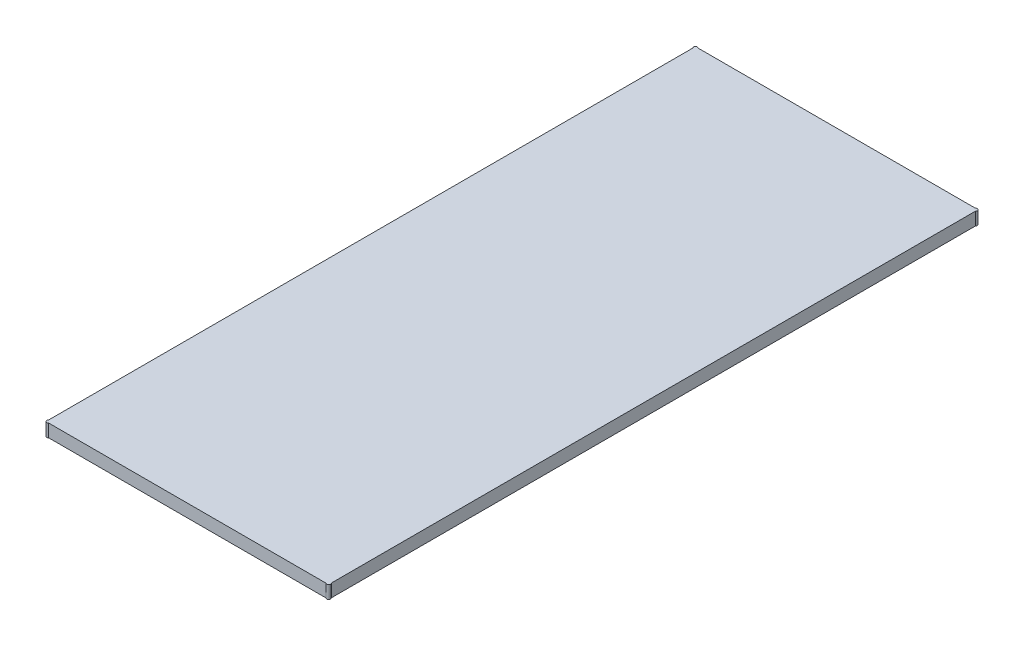
ISO-10303-21;
HEADER;
FILE_DESCRIPTION(('STEP AP214'),'2;1');
FILE_NAME('part.step','',(''),(''),'','','');
FILE_SCHEMA(('AUTOMOTIVE_DESIGN { 1 0 10303 214 1 1 1 1 }'));
ENDSEC;
DATA;
#1=APPLICATION_CONTEXT('core data for automotive mechanical design processes');
#2=APPLICATION_PROTOCOL_DEFINITION('international standard','automotive_design',2000,#1);
#3=PRODUCT_CONTEXT('',#1,'mechanical');
#4=PRODUCT('Part','Part','',(#3));
#5=PRODUCT_RELATED_PRODUCT_CATEGORY('part','',(#4));
#6=PRODUCT_DEFINITION_FORMATION('','',#4);
#7=PRODUCT_DEFINITION_CONTEXT('part definition',#1,'design');
#8=PRODUCT_DEFINITION('design','',#6,#7);
#9=PRODUCT_DEFINITION_SHAPE('','',#8);
#10=(LENGTH_UNIT() NAMED_UNIT(*) SI_UNIT(.MILLI.,.METRE.));
#11=(NAMED_UNIT(*) PLANE_ANGLE_UNIT() SI_UNIT($,.RADIAN.));
#12=(NAMED_UNIT(*) SI_UNIT($,.STERADIAN.) SOLID_ANGLE_UNIT());
#13=UNCERTAINTY_MEASURE_WITH_UNIT(LENGTH_MEASURE(1.E-05),#10,'distance_accuracy_value','');
#14=(GEOMETRIC_REPRESENTATION_CONTEXT(3) GLOBAL_UNCERTAINTY_ASSIGNED_CONTEXT((#13)) GLOBAL_UNIT_ASSIGNED_CONTEXT((#10,
#11,#12)) REPRESENTATION_CONTEXT('',''));
#15=CARTESIAN_POINT('',(0.,0.,0.));
#16=DIRECTION('',(0.,0.,1.));
#17=DIRECTION('',(1.,0.,0.));
#18=AXIS2_PLACEMENT_3D('',#15,#16,#17);
#19=CARTESIAN_POINT('',(1.04775,2.9906,-3.07975));
#20=DIRECTION('',(0.,-1.,0.));
#21=DIRECTION('',(-1.,0.,0.));
#22=AXIS2_PLACEMENT_3D('',#19,#20,#21);
#23=CYLINDRICAL_SURFACE('',#22,0.00898025612106621);
#24=CARTESIAN_POINT('',(1.04775,2.9906,-3.07975));
#25=DIRECTION('',(0.,1.,0.));
#26=DIRECTION('',(1.,0.,0.));
#27=AXIS2_PLACEMENT_3D('',#24,#25,#26);
#28=CIRCLE('',#27,0.00898025612106621);
#29=CARTESIAN_POINT('',(1.038769743879,2.9906,-3.07975));
#30=VERTEX_POINT('',#29);
#31=CARTESIAN_POINT('',(1.0541,2.9906,-3.0734));
#32=VERTEX_POINT('',#31);
#33=EDGE_CURVE('E11',#30,#32,#28,.T.);
#34=ORIENTED_EDGE('',*,*,#33,.F.);
#35=DIRECTION('',(0.,-1.,0.));
#36=VECTOR('',#35,1.);
#37=CARTESIAN_POINT('',(1.038769743879,2.9906,-3.07975));
#38=LINE('',#37,#36);
#39=CARTESIAN_POINT('',(1.038769743879,2.9306,-3.07975));
#40=VERTEX_POINT('',#39);
#41=EDGE_CURVE('E24',#30,#40,#38,.T.);
#42=ORIENTED_EDGE('',*,*,#41,.T.);
#43=CARTESIAN_POINT('',(1.04775,2.9306,-3.07975));
#44=DIRECTION('',(0.,1.,0.));
#45=DIRECTION('',(1.,0.,0.));
#46=AXIS2_PLACEMENT_3D('',#43,#44,#45);
#47=CIRCLE('',#46,0.00898025612106621);
#48=CARTESIAN_POINT('',(1.0541,2.9306,-3.0734));
#49=VERTEX_POINT('',#48);
#50=EDGE_CURVE('E170',#40,#49,#47,.T.);
#51=ORIENTED_EDGE('',*,*,#50,.T.);
#52=DIRECTION('',(0.,-1.,0.));
#53=VECTOR('',#52,1.);
#54=CARTESIAN_POINT('',(1.0541,2.9906,-3.0734));
#55=LINE('',#54,#53);
#56=EDGE_CURVE('E167',#32,#49,#55,.T.);
#57=ORIENTED_EDGE('',*,*,#56,.F.);
#58=EDGE_LOOP('',(#34,#42,#51,#57));
#59=FACE_BOUND('',#58,.T.);
#60=ADVANCED_FACE('F17',(#59),#23,.T.);
#61=CARTESIAN_POINT('',(1.04775,2.9906,-6.10235));
#62=DIRECTION('',(0.,-1.,0.));
#63=DIRECTION('',(-1.,0.,0.));
#64=AXIS2_PLACEMENT_3D('',#61,#62,#63);
#65=CYLINDRICAL_SURFACE('',#64,0.00898025612106621);
#66=CARTESIAN_POINT('',(1.04775,2.9906,-6.10235));
#67=DIRECTION('',(0.,1.,0.));
#68=DIRECTION('',(1.,0.,0.));
#69=AXIS2_PLACEMENT_3D('',#66,#67,#68);
#70=CIRCLE('',#69,0.00898025612106621);
#71=CARTESIAN_POINT('',(1.038769743879,2.9906,-6.10235));
#72=VERTEX_POINT('',#71);
#73=CARTESIAN_POINT('',(1.0414,2.9906,-6.096));
#74=VERTEX_POINT('',#73);
#75=EDGE_CURVE('E165',#72,#74,#70,.T.);
#76=ORIENTED_EDGE('',*,*,#75,.F.);
#77=DIRECTION('',(0.,-1.,0.));
#78=VECTOR('',#77,1.);
#79=CARTESIAN_POINT('',(1.038769743879,2.9906,-6.10235));
#80=LINE('',#79,#78);
#81=CARTESIAN_POINT('',(1.038769743879,2.9306,-6.10235));
#82=VERTEX_POINT('',#81);
#83=EDGE_CURVE('E163',#72,#82,#80,.T.);
#84=ORIENTED_EDGE('',*,*,#83,.T.);
#85=CARTESIAN_POINT('',(1.04775,2.9306,-6.10235));
#86=DIRECTION('',(0.,1.,0.));
#87=DIRECTION('',(1.,0.,0.));
#88=AXIS2_PLACEMENT_3D('',#85,#86,#87);
#89=CIRCLE('',#88,0.00898025612106621);
#90=CARTESIAN_POINT('',(1.0414,2.9306,-6.096));
#91=VERTEX_POINT('',#90);
#92=EDGE_CURVE('E161',#82,#91,#89,.T.);
#93=ORIENTED_EDGE('',*,*,#92,.T.);
#94=DIRECTION('',(0.,-1.,0.));
#95=VECTOR('',#94,1.);
#96=CARTESIAN_POINT('',(1.0414,2.9906,-6.096));
#97=LINE('',#96,#95);
#98=EDGE_CURVE('E158',#74,#91,#97,.T.);
#99=ORIENTED_EDGE('',*,*,#98,.F.);
#100=EDGE_LOOP('',(#76,#84,#93,#99));
#101=FACE_BOUND('',#100,.T.);
#102=ADVANCED_FACE('F187',(#101),#65,.T.);
#103=CARTESIAN_POINT('',(2.35585,2.9906,-6.10235));
#104=DIRECTION('',(0.,-1.,0.));
#105=DIRECTION('',(-1.,0.,0.));
#106=AXIS2_PLACEMENT_3D('',#103,#104,#105);
#107=CYLINDRICAL_SURFACE('',#106,0.00898025612106621);
#108=CARTESIAN_POINT('',(2.35585,2.9306,-6.10235));
#109=DIRECTION('',(0.,1.,0.));
#110=DIRECTION('',(1.,0.,0.));
#111=AXIS2_PLACEMENT_3D('',#108,#109,#110);
#112=CIRCLE('',#111,0.00898025612106621);
#113=CARTESIAN_POINT('',(2.3622,2.9306,-6.096));
#114=VERTEX_POINT('',#113);
#115=CARTESIAN_POINT('',(2.3495,2.9306,-6.1087));
#116=VERTEX_POINT('',#115);
#117=EDGE_CURVE('E156',#114,#116,#112,.T.);
#118=ORIENTED_EDGE('',*,*,#117,.T.);
#119=DIRECTION('',(0.,-1.,0.));
#120=VECTOR('',#119,1.);
#121=CARTESIAN_POINT('',(2.3495,2.9906,-6.1087));
#122=LINE('',#121,#120);
#123=CARTESIAN_POINT('',(2.3495,2.9906,-6.1087));
#124=VERTEX_POINT('',#123);
#125=EDGE_CURVE('E153',#124,#116,#122,.T.);
#126=ORIENTED_EDGE('',*,*,#125,.F.);
#127=CARTESIAN_POINT('',(2.35585,2.9906,-6.10235));
#128=DIRECTION('',(0.,1.,0.));
#129=DIRECTION('',(1.,0.,0.));
#130=AXIS2_PLACEMENT_3D('',#127,#128,#129);
#131=CIRCLE('',#130,0.00898025612106621);
#132=CARTESIAN_POINT('',(2.3622,2.9906,-6.096));
#133=VERTEX_POINT('',#132);
#134=EDGE_CURVE('E151',#133,#124,#131,.T.);
#135=ORIENTED_EDGE('',*,*,#134,.F.);
#136=DIRECTION('',(0.,-1.,0.));
#137=VECTOR('',#136,1.);
#138=CARTESIAN_POINT('',(2.3622,2.9906,-6.096));
#139=LINE('',#138,#137);
#140=EDGE_CURVE('E113',#133,#114,#139,.T.);
#141=ORIENTED_EDGE('',*,*,#140,.T.);
#142=EDGE_LOOP('',(#118,#126,#135,#141));
#143=FACE_BOUND('',#142,.T.);
#144=ADVANCED_FACE('F197',(#143),#107,.T.);
#145=CARTESIAN_POINT('',(1.0541,2.9906,-6.1087));
#146=DIRECTION('',(0.,0.,1.));
#147=DIRECTION('',(0.,-1.,0.));
#148=AXIS2_PLACEMENT_3D('',#145,#146,#147);
#149=PLANE('',#148);
#150=DIRECTION('',(-1.,0.,0.));
#151=VECTOR('',#150,1.);
#152=CARTESIAN_POINT('',(1.0541,2.9306,-6.1087));
#153=LINE('',#152,#151);
#154=CARTESIAN_POINT('',(1.0541,2.9306,-6.1087));
#155=VERTEX_POINT('',#154);
#156=EDGE_CURVE('E148',#116,#155,#153,.T.);
#157=ORIENTED_EDGE('',*,*,#156,.T.);
#158=DIRECTION('',(0.,-1.,0.));
#159=VECTOR('',#158,1.);
#160=CARTESIAN_POINT('',(1.0541,2.9906,-6.1087));
#161=LINE('',#160,#159);
#162=CARTESIAN_POINT('',(1.0541,2.9906,-6.1087));
#163=VERTEX_POINT('',#162);
#164=EDGE_CURVE('E145',#163,#155,#161,.T.);
#165=ORIENTED_EDGE('',*,*,#164,.F.);
#166=DIRECTION('',(-1.,0.,0.));
#167=VECTOR('',#166,1.);
#168=CARTESIAN_POINT('',(1.0541,2.9906,-6.1087));
#169=LINE('',#168,#167);
#170=EDGE_CURVE('E142',#124,#163,#169,.T.);
#171=ORIENTED_EDGE('',*,*,#170,.F.);
#172=ORIENTED_EDGE('',*,*,#125,.T.);
#173=EDGE_LOOP('',(#157,#165,#171,#172));
#174=FACE_BOUND('',#173,.T.);
#175=ADVANCED_FACE('F195',(#174),#149,.F.);
#176=CARTESIAN_POINT('',(1.04775,2.9906,-6.10235));
#177=DIRECTION('',(0.,-1.,0.));
#178=DIRECTION('',(-1.,0.,0.));
#179=AXIS2_PLACEMENT_3D('',#176,#177,#178);
#180=CYLINDRICAL_SURFACE('',#179,0.00898025612106621);
#181=ORIENTED_EDGE('',*,*,#83,.F.);
#182=CARTESIAN_POINT('',(1.04775,2.9906,-6.10235));
#183=DIRECTION('',(0.,1.,0.));
#184=DIRECTION('',(1.,0.,0.));
#185=AXIS2_PLACEMENT_3D('',#182,#183,#184);
#186=CIRCLE('',#185,0.00898025612106621);
#187=EDGE_CURVE('E139',#163,#72,#186,.T.);
#188=ORIENTED_EDGE('',*,*,#187,.F.);
#189=ORIENTED_EDGE('',*,*,#164,.T.);
#190=CARTESIAN_POINT('',(1.04775,2.9306,-6.10235));
#191=DIRECTION('',(0.,1.,0.));
#192=DIRECTION('',(1.,0.,0.));
#193=AXIS2_PLACEMENT_3D('',#190,#191,#192);
#194=CIRCLE('',#193,0.00898025612106621);
#195=EDGE_CURVE('E136',#155,#82,#194,.T.);
#196=ORIENTED_EDGE('',*,*,#195,.T.);
#197=EDGE_LOOP('',(#181,#188,#189,#196));
#198=FACE_BOUND('',#197,.T.);
#199=ADVANCED_FACE('F192',(#198),#180,.T.);
#200=CARTESIAN_POINT('',(1.0414,2.9906,-3.0861));
#201=DIRECTION('',(1.,0.,0.));
#202=DIRECTION('',(0.,-1.,0.));
#203=AXIS2_PLACEMENT_3D('',#200,#201,#202);
#204=PLANE('',#203);
#205=DIRECTION('',(0.,0.,1.));
#206=VECTOR('',#205,1.);
#207=CARTESIAN_POINT('',(1.0414,2.9306,-3.0861));
#208=LINE('',#207,#206);
#209=CARTESIAN_POINT('',(1.0414,2.9306,-3.0861));
#210=VERTEX_POINT('',#209);
#211=EDGE_CURVE('E134',#91,#210,#208,.T.);
#212=ORIENTED_EDGE('',*,*,#211,.T.);
#213=DIRECTION('',(0.,-1.,0.));
#214=VECTOR('',#213,1.);
#215=CARTESIAN_POINT('',(1.0414,2.9906,-3.0861));
#216=LINE('',#215,#214);
#217=CARTESIAN_POINT('',(1.0414,2.9906,-3.0861));
#218=VERTEX_POINT('',#217);
#219=EDGE_CURVE('E131',#218,#210,#216,.T.);
#220=ORIENTED_EDGE('',*,*,#219,.F.);
#221=DIRECTION('',(0.,0.,1.));
#222=VECTOR('',#221,1.);
#223=CARTESIAN_POINT('',(1.0414,2.9906,-3.0861));
#224=LINE('',#223,#222);
#225=EDGE_CURVE('E128',#74,#218,#224,.T.);
#226=ORIENTED_EDGE('',*,*,#225,.F.);
#227=ORIENTED_EDGE('',*,*,#98,.T.);
#228=EDGE_LOOP('',(#212,#220,#226,#227));
#229=FACE_BOUND('',#228,.T.);
#230=ADVANCED_FACE('F182',(#229),#204,.F.);
#231=CARTESIAN_POINT('',(1.04775,2.9906,-3.07975));
#232=DIRECTION('',(0.,-1.,0.));
#233=DIRECTION('',(-1.,0.,0.));
#234=AXIS2_PLACEMENT_3D('',#231,#232,#233);
#235=CYLINDRICAL_SURFACE('',#234,0.00898025612106621);
#236=ORIENTED_EDGE('',*,*,#41,.F.);
#237=CARTESIAN_POINT('',(1.04775,2.9906,-3.07975));
#238=DIRECTION('',(0.,1.,0.));
#239=DIRECTION('',(1.,0.,0.));
#240=AXIS2_PLACEMENT_3D('',#237,#238,#239);
#241=CIRCLE('',#240,0.00898025612106621);
#242=EDGE_CURVE('E126',#218,#30,#241,.T.);
#243=ORIENTED_EDGE('',*,*,#242,.F.);
#244=ORIENTED_EDGE('',*,*,#219,.T.);
#245=CARTESIAN_POINT('',(1.04775,2.9306,-3.07975));
#246=DIRECTION('',(0.,1.,0.));
#247=DIRECTION('',(1.,0.,0.));
#248=AXIS2_PLACEMENT_3D('',#245,#246,#247);
#249=CIRCLE('',#248,0.00898025612106621);
#250=EDGE_CURVE('E123',#210,#40,#249,.T.);
#251=ORIENTED_EDGE('',*,*,#250,.T.);
#252=EDGE_LOOP('',(#236,#243,#244,#251));
#253=FACE_BOUND('',#252,.T.);
#254=ADVANCED_FACE('F179',(#253),#235,.T.);
#255=CARTESIAN_POINT('',(2.3495,2.9906,-3.0734));
#256=DIRECTION('',(0.,0.,-1.));
#257=DIRECTION('',(0.,1.,0.));
#258=AXIS2_PLACEMENT_3D('',#255,#256,#257);
#259=PLANE('',#258);
#260=DIRECTION('',(1.,0.,0.));
#261=VECTOR('',#260,1.);
#262=CARTESIAN_POINT('',(2.3495,2.9306,-3.0734));
#263=LINE('',#262,#261);
#264=CARTESIAN_POINT('',(2.3495,2.9306,-3.0734));
#265=VERTEX_POINT('',#264);
#266=EDGE_CURVE('E121',#49,#265,#263,.T.);
#267=ORIENTED_EDGE('',*,*,#266,.T.);
#268=DIRECTION('',(0.,-1.,0.));
#269=VECTOR('',#268,1.);
#270=CARTESIAN_POINT('',(2.3495,2.9906,-3.0734));
#271=LINE('',#270,#269);
#272=CARTESIAN_POINT('',(2.3495,2.9906,-3.0734));
#273=VERTEX_POINT('',#272);
#274=EDGE_CURVE('E119',#273,#265,#271,.T.);
#275=ORIENTED_EDGE('',*,*,#274,.F.);
#276=DIRECTION('',(1.,0.,0.));
#277=VECTOR('',#276,1.);
#278=CARTESIAN_POINT('',(2.3495,2.9906,-3.0734));
#279=LINE('',#278,#277);
#280=EDGE_CURVE('E107',#32,#273,#279,.T.);
#281=ORIENTED_EDGE('',*,*,#280,.F.);
#282=ORIENTED_EDGE('',*,*,#56,.T.);
#283=EDGE_LOOP('',(#267,#275,#281,#282));
#284=FACE_BOUND('',#283,.T.);
#285=ADVANCED_FACE('F256',(#284),#259,.F.);
#286=CARTESIAN_POINT('',(2.35585,2.9906,-3.07975));
#287=DIRECTION('',(0.,-1.,0.));
#288=DIRECTION('',(-1.,0.,0.));
#289=AXIS2_PLACEMENT_3D('',#286,#287,#288);
#290=CYLINDRICAL_SURFACE('',#289,0.00898025612106621);
#291=CARTESIAN_POINT('',(2.35585,2.9306,-3.07975));
#292=DIRECTION('',(0.,1.,0.));
#293=DIRECTION('',(1.,0.,0.));
#294=AXIS2_PLACEMENT_3D('',#291,#292,#293);
#295=CIRCLE('',#294,0.00898025612106621);
#296=CARTESIAN_POINT('',(2.3622,2.9306,-3.0861));
#297=VERTEX_POINT('',#296);
#298=EDGE_CURVE('E96',#265,#297,#295,.T.);
#299=ORIENTED_EDGE('',*,*,#298,.T.);
#300=DIRECTION('',(0.,-1.,0.));
#301=VECTOR('',#300,1.);
#302=CARTESIAN_POINT('',(2.3622,2.9906,-3.0861));
#303=LINE('',#302,#301);
#304=CARTESIAN_POINT('',(2.3622,2.9906,-3.0861));
#305=VERTEX_POINT('',#304);
#306=EDGE_CURVE('E90',#305,#297,#303,.T.);
#307=ORIENTED_EDGE('',*,*,#306,.F.);
#308=CARTESIAN_POINT('',(2.35585,2.9906,-3.07975));
#309=DIRECTION('',(0.,1.,0.));
#310=DIRECTION('',(1.,0.,0.));
#311=AXIS2_PLACEMENT_3D('',#308,#309,#310);
#312=CIRCLE('',#311,0.00898025612106621);
#313=EDGE_CURVE('E94',#273,#305,#312,.T.);
#314=ORIENTED_EDGE('',*,*,#313,.F.);
#315=ORIENTED_EDGE('',*,*,#274,.T.);
#316=EDGE_LOOP('',(#299,#307,#314,#315));
#317=FACE_BOUND('',#316,.T.);
#318=ADVANCED_FACE('F92',(#317),#290,.T.);
#319=CARTESIAN_POINT('',(2.3622,2.9906,-6.096));
#320=DIRECTION('',(-1.,0.,0.));
#321=DIRECTION('',(0.,1.,0.));
#322=AXIS2_PLACEMENT_3D('',#319,#320,#321);
#323=PLANE('',#322);
#324=DIRECTION('',(0.,0.,-1.));
#325=VECTOR('',#324,1.);
#326=CARTESIAN_POINT('',(2.3622,2.9306,-6.096));
#327=LINE('',#326,#325);
#328=EDGE_CURVE('E108',#297,#114,#327,.T.);
#329=ORIENTED_EDGE('',*,*,#328,.T.);
#330=ORIENTED_EDGE('',*,*,#140,.F.);
#331=DIRECTION('',(0.,0.,-1.));
#332=VECTOR('',#331,1.);
#333=CARTESIAN_POINT('',(2.3622,2.9906,-6.096));
#334=LINE('',#333,#332);
#335=EDGE_CURVE('E105',#305,#133,#334,.T.);
#336=ORIENTED_EDGE('',*,*,#335,.F.);
#337=ORIENTED_EDGE('',*,*,#306,.T.);
#338=EDGE_LOOP('',(#329,#330,#336,#337));
#339=FACE_BOUND('',#338,.T.);
#340=ADVANCED_FACE('F111',(#339),#323,.F.);
#341=CARTESIAN_POINT('',(2.35585,2.9906,-6.10235));
#342=DIRECTION('',(0.,1.,0.));
#343=DIRECTION('',(1.,0.,0.));
#344=AXIS2_PLACEMENT_3D('',#341,#342,#343);
#345=PLANE('',#344);
#346=ORIENTED_EDGE('',*,*,#134,.T.);
#347=ORIENTED_EDGE('',*,*,#170,.T.);
#348=ORIENTED_EDGE('',*,*,#187,.T.);
#349=ORIENTED_EDGE('',*,*,#75,.T.);
#350=ORIENTED_EDGE('',*,*,#225,.T.);
#351=ORIENTED_EDGE('',*,*,#242,.T.);
#352=ORIENTED_EDGE('',*,*,#33,.T.);
#353=ORIENTED_EDGE('',*,*,#280,.T.);
#354=ORIENTED_EDGE('',*,*,#313,.T.);
#355=ORIENTED_EDGE('',*,*,#335,.T.);
#356=EDGE_LOOP('',(#346,#347,#348,#349,#350,#351,#352,#353,#354,#355));
#357=FACE_BOUND('',#356,.T.);
#358=ADVANCED_FACE('F104',(#357),#345,.T.);
#359=CARTESIAN_POINT('',(2.35585,2.9306,-6.10235));
#360=DIRECTION('',(0.,1.,0.));
#361=DIRECTION('',(1.,0.,0.));
#362=AXIS2_PLACEMENT_3D('',#359,#360,#361);
#363=PLANE('',#362);
#364=ORIENTED_EDGE('',*,*,#117,.F.);
#365=ORIENTED_EDGE('',*,*,#328,.F.);
#366=ORIENTED_EDGE('',*,*,#298,.F.);
#367=ORIENTED_EDGE('',*,*,#266,.F.);
#368=ORIENTED_EDGE('',*,*,#50,.F.);
#369=ORIENTED_EDGE('',*,*,#250,.F.);
#370=ORIENTED_EDGE('',*,*,#211,.F.);
#371=ORIENTED_EDGE('',*,*,#92,.F.);
#372=ORIENTED_EDGE('',*,*,#195,.F.);
#373=ORIENTED_EDGE('',*,*,#156,.F.);
#374=EDGE_LOOP('',(#364,#365,#366,#367,#368,#369,#370,#371,#372,#373));
#375=FACE_BOUND('',#374,.T.);
#376=ADVANCED_FACE('F177',(#375),#363,.F.);
#377=CLOSED_SHELL('',(#60,#102,#144,#175,#199,#230,#254,#285,#318,#340,#358,#376));
#378=MANIFOLD_SOLID_BREP('B1',#377);
#379=ADVANCED_BREP_SHAPE_REPRESENTATION('',(#18,#378),#14);
#380=SHAPE_DEFINITION_REPRESENTATION(#9,#379);
ENDSEC;
END-ISO-10303-21;
